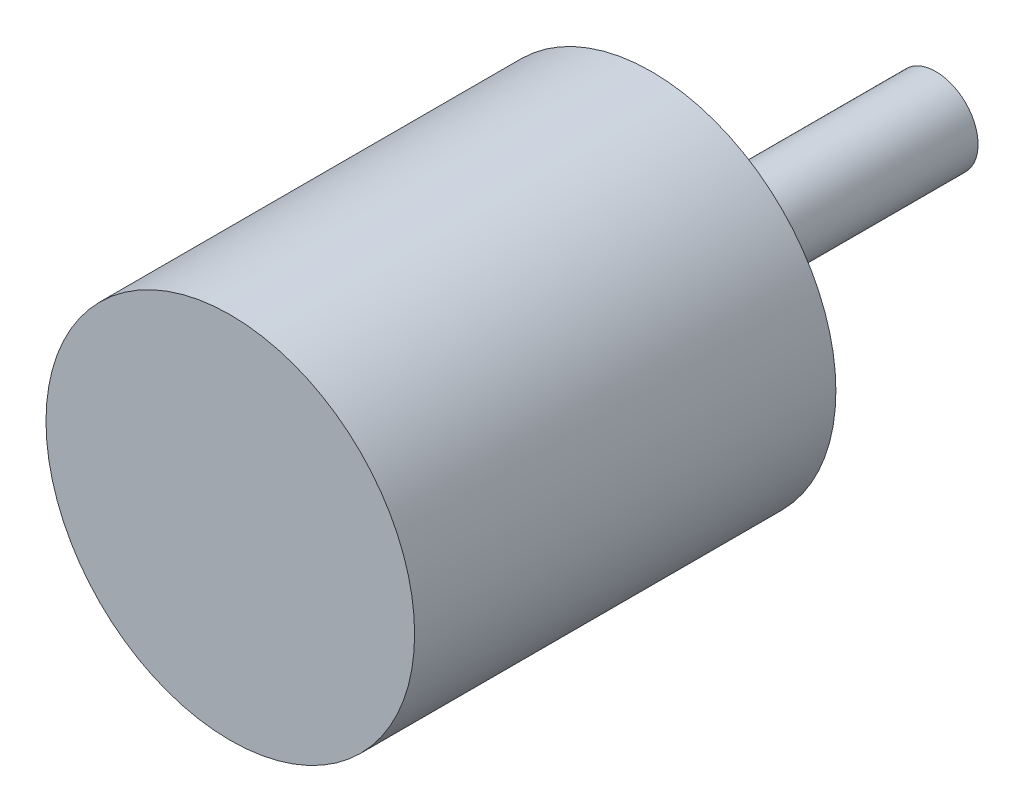
ISO-10303-21;
HEADER;
FILE_DESCRIPTION(('STEP AP214'),'2;1');
FILE_NAME('part.step','',(''),(''),'','','');
FILE_SCHEMA(('AUTOMOTIVE_DESIGN { 1 0 10303 214 1 1 1 1 }'));
ENDSEC;
DATA;
#1=APPLICATION_CONTEXT('core data for automotive mechanical design processes');
#2=APPLICATION_PROTOCOL_DEFINITION('international standard','automotive_design',2000,#1);
#3=PRODUCT_CONTEXT('',#1,'mechanical');
#4=PRODUCT('Part','Part','',(#3));
#5=PRODUCT_RELATED_PRODUCT_CATEGORY('part','',(#4));
#6=PRODUCT_DEFINITION_FORMATION('','',#4);
#7=PRODUCT_DEFINITION_CONTEXT('part definition',#1,'design');
#8=PRODUCT_DEFINITION('design','',#6,#7);
#9=PRODUCT_DEFINITION_SHAPE('','',#8);
#10=(LENGTH_UNIT() NAMED_UNIT(*) SI_UNIT(.MILLI.,.METRE.));
#11=(NAMED_UNIT(*) PLANE_ANGLE_UNIT() SI_UNIT($,.RADIAN.));
#12=(NAMED_UNIT(*) SI_UNIT($,.STERADIAN.) SOLID_ANGLE_UNIT());
#13=UNCERTAINTY_MEASURE_WITH_UNIT(LENGTH_MEASURE(1.E-05),#10,'distance_accuracy_value','');
#14=(GEOMETRIC_REPRESENTATION_CONTEXT(3) GLOBAL_UNCERTAINTY_ASSIGNED_CONTEXT((#13)) GLOBAL_UNIT_ASSIGNED_CONTEXT((#10,
#11,#12)) REPRESENTATION_CONTEXT('',''));
#15=CARTESIAN_POINT('',(0.,0.,0.));
#16=DIRECTION('',(0.,0.,1.));
#17=DIRECTION('',(1.,0.,0.));
#18=AXIS2_PLACEMENT_3D('',#15,#16,#17);
#19=CARTESIAN_POINT('',(0.,0.,-17.));
#20=DIRECTION('',(0.,0.,1.));
#21=DIRECTION('',(1.,0.,0.));
#22=AXIS2_PLACEMENT_3D('',#19,#20,#21);
#23=CYLINDRICAL_SURFACE('',#22,2.);
#24=CARTESIAN_POINT('',(0.,0.,0.));
#25=DIRECTION('',(0.,0.,1.));
#26=DIRECTION('',(1.,0.,0.));
#27=AXIS2_PLACEMENT_3D('',#24,#25,#26);
#28=CIRCLE('',#27,2.);
#29=CARTESIAN_POINT('',(2.,0.,0.));
#30=VERTEX_POINT('',#29);
#31=EDGE_CURVE('E38',#30,#30,#28,.F.);
#32=ORIENTED_EDGE('',*,*,#31,.T.);
#33=EDGE_LOOP('',(#32));
#34=FACE_BOUND('',#33,.T.);
#35=CARTESIAN_POINT('',(0.,0.,-7.));
#36=DIRECTION('',(0.,0.,-1.));
#37=DIRECTION('',(-1.,0.,0.));
#38=AXIS2_PLACEMENT_3D('',#35,#36,#37);
#39=CIRCLE('',#38,2.);
#40=CARTESIAN_POINT('',(-2.,0.,-7.));
#41=VERTEX_POINT('',#40);
#42=EDGE_CURVE('E10',#41,#41,#39,.T.);
#43=ORIENTED_EDGE('',*,*,#42,.F.);
#44=EDGE_LOOP('',(#43));
#45=FACE_BOUND('',#44,.T.);
#46=ADVANCED_FACE('F31',(#34,#45),#23,.T.);
#47=CARTESIAN_POINT('',(0.,0.,40.));
#48=DIRECTION('',(0.,0.,-1.));
#49=DIRECTION('',(-1.,0.,0.));
#50=AXIS2_PLACEMENT_3D('',#47,#48,#49);
#51=CYLINDRICAL_SURFACE('',#50,17.5);
#52=CARTESIAN_POINT('',(0.,0.,40.));
#53=DIRECTION('',(0.,0.,1.));
#54=DIRECTION('',(1.,0.,0.));
#55=AXIS2_PLACEMENT_3D('',#52,#53,#54);
#56=CIRCLE('',#55,17.5);
#57=CARTESIAN_POINT('',(17.5,0.,40.));
#58=VERTEX_POINT('',#57);
#59=EDGE_CURVE('E42',#58,#58,#56,.T.);
#60=ORIENTED_EDGE('',*,*,#59,.F.);
#61=EDGE_LOOP('',(#60));
#62=FACE_BOUND('',#61,.T.);
#63=CARTESIAN_POINT('',(0.,0.,0.));
#64=DIRECTION('',(0.,0.,1.));
#65=DIRECTION('',(1.,0.,0.));
#66=AXIS2_PLACEMENT_3D('',#63,#64,#65);
#67=CIRCLE('',#66,17.5);
#68=CARTESIAN_POINT('',(17.5,0.,0.));
#69=VERTEX_POINT('',#68);
#70=EDGE_CURVE('E46',#69,#69,#67,.T.);
#71=ORIENTED_EDGE('',*,*,#70,.T.);
#72=EDGE_LOOP('',(#71));
#73=FACE_BOUND('',#72,.T.);
#74=ADVANCED_FACE('F33',(#62,#73),#51,.T.);
#75=CARTESIAN_POINT('',(0.,0.,40.));
#76=DIRECTION('',(0.,0.,1.));
#77=DIRECTION('',(1.,0.,0.));
#78=AXIS2_PLACEMENT_3D('',#75,#76,#77);
#79=PLANE('',#78);
#80=ORIENTED_EDGE('',*,*,#59,.T.);
#81=EDGE_LOOP('',(#80));
#82=FACE_BOUND('',#81,.T.);
#83=ADVANCED_FACE('F71',(#82),#79,.T.);
#84=CARTESIAN_POINT('',(0.,0.,0.));
#85=DIRECTION('',(0.,0.,1.));
#86=DIRECTION('',(1.,0.,0.));
#87=AXIS2_PLACEMENT_3D('',#84,#85,#86);
#88=PLANE('',#87);
#89=ORIENTED_EDGE('',*,*,#31,.F.);
#90=EDGE_LOOP('',(#89));
#91=FACE_BOUND('',#90,.T.);
#92=ORIENTED_EDGE('',*,*,#70,.F.);
#93=EDGE_LOOP('',(#92));
#94=FACE_BOUND('',#93,.T.);
#95=ADVANCED_FACE('F63',(#91,#94),#88,.F.);
#96=CARTESIAN_POINT('',(0.,0.,-7.));
#97=DIRECTION('',(0.,0.,-1.));
#98=DIRECTION('',(-1.,0.,0.));
#99=AXIS2_PLACEMENT_3D('',#96,#97,#98);
#100=CYLINDRICAL_SURFACE('',#99,4.);
#101=CARTESIAN_POINT('',(0.,0.,-7.));
#102=DIRECTION('',(0.,0.,-1.));
#103=DIRECTION('',(-1.,0.,0.));
#104=AXIS2_PLACEMENT_3D('',#101,#102,#103);
#105=CIRCLE('',#104,4.);
#106=CARTESIAN_POINT('',(-4.,0.,-7.));
#107=VERTEX_POINT('',#106);
#108=EDGE_CURVE('E50',#107,#107,#105,.T.);
#109=ORIENTED_EDGE('',*,*,#108,.T.);
#110=EDGE_LOOP('',(#109));
#111=FACE_BOUND('',#110,.T.);
#112=CARTESIAN_POINT('',(0.,0.,-27.));
#113=DIRECTION('',(0.,0.,-1.));
#114=DIRECTION('',(-1.,0.,0.));
#115=AXIS2_PLACEMENT_3D('',#112,#113,#114);
#116=CIRCLE('',#115,4.);
#117=CARTESIAN_POINT('',(-4.,0.,-27.));
#118=VERTEX_POINT('',#117);
#119=EDGE_CURVE('E54',#118,#118,#116,.T.);
#120=ORIENTED_EDGE('',*,*,#119,.F.);
#121=EDGE_LOOP('',(#120));
#122=FACE_BOUND('',#121,.T.);
#123=ADVANCED_FACE('F60',(#111,#122),#100,.T.);
#124=CARTESIAN_POINT('',(0.,0.,-7.));
#125=DIRECTION('',(0.,0.,-1.));
#126=DIRECTION('',(-1.,0.,0.));
#127=AXIS2_PLACEMENT_3D('',#124,#125,#126);
#128=PLANE('',#127);
#129=ORIENTED_EDGE('',*,*,#42,.T.);
#130=EDGE_LOOP('',(#129));
#131=FACE_BOUND('',#130,.T.);
#132=ORIENTED_EDGE('',*,*,#108,.F.);
#133=EDGE_LOOP('',(#132));
#134=FACE_BOUND('',#133,.T.);
#135=ADVANCED_FACE('F62',(#131,#134),#128,.F.);
#136=CARTESIAN_POINT('',(0.,0.,-27.));
#137=DIRECTION('',(0.,0.,-1.));
#138=DIRECTION('',(-1.,0.,0.));
#139=AXIS2_PLACEMENT_3D('',#136,#137,#138);
#140=PLANE('',#139);
#141=ORIENTED_EDGE('',*,*,#119,.T.);
#142=EDGE_LOOP('',(#141));
#143=FACE_BOUND('',#142,.T.);
#144=ADVANCED_FACE('F58',(#143),#140,.T.);
#145=CLOSED_SHELL('',(#46,#74,#83,#95,#123,#135,#144));
#146=MANIFOLD_SOLID_BREP('B2',#145);
#147=ADVANCED_BREP_SHAPE_REPRESENTATION('',(#18,#146),#14);
#148=SHAPE_DEFINITION_REPRESENTATION(#9,#147);
ENDSEC;
END-ISO-10303-21;
